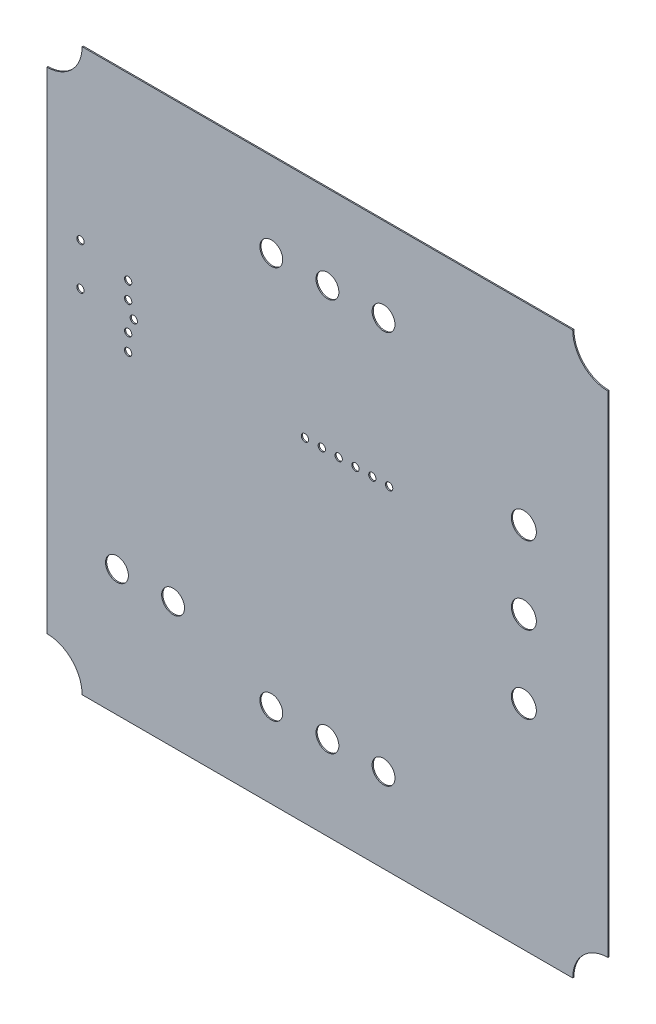
ISO-10303-21;
HEADER;
FILE_DESCRIPTION(('STEP AP214'),'2;1');
FILE_NAME('part.step','',(''),(''),'','','');
FILE_SCHEMA(('AUTOMOTIVE_DESIGN { 1 0 10303 214 1 1 1 1 }'));
ENDSEC;
DATA;
#1=APPLICATION_CONTEXT('core data for automotive mechanical design processes');
#2=APPLICATION_PROTOCOL_DEFINITION('international standard','automotive_design',2000,#1);
#3=PRODUCT_CONTEXT('',#1,'mechanical');
#4=PRODUCT('Part','Part','',(#3));
#5=PRODUCT_RELATED_PRODUCT_CATEGORY('part','',(#4));
#6=PRODUCT_DEFINITION_FORMATION('','',#4);
#7=PRODUCT_DEFINITION_CONTEXT('part definition',#1,'design');
#8=PRODUCT_DEFINITION('design','',#6,#7);
#9=PRODUCT_DEFINITION_SHAPE('','',#8);
#10=(LENGTH_UNIT() NAMED_UNIT(*) SI_UNIT(.MILLI.,.METRE.));
#11=(NAMED_UNIT(*) PLANE_ANGLE_UNIT() SI_UNIT($,.RADIAN.));
#12=(NAMED_UNIT(*) SI_UNIT($,.STERADIAN.) SOLID_ANGLE_UNIT());
#13=UNCERTAINTY_MEASURE_WITH_UNIT(LENGTH_MEASURE(1.E-05),#10,'distance_accuracy_value','');
#14=(GEOMETRIC_REPRESENTATION_CONTEXT(3) GLOBAL_UNCERTAINTY_ASSIGNED_CONTEXT((#13)) GLOBAL_UNIT_ASSIGNED_CONTEXT((#10,
#11,#12)) REPRESENTATION_CONTEXT('',''));
#15=CARTESIAN_POINT('',(0.,0.,0.));
#16=DIRECTION('',(0.,0.,1.));
#17=DIRECTION('',(1.,0.,0.));
#18=AXIS2_PLACEMENT_3D('',#15,#16,#17);
#19=CARTESIAN_POINT('',(23.81,25.3999999257102,-0.00525));
#20=DIRECTION('',(3.34488272038687E-09,1.,0.));
#21=DIRECTION('',(-1.,3.34488272038687E-09,0.));
#22=AXIS2_PLACEMENT_3D('',#19,#20,#21);
#23=PLANE('',#22);
#24=DIRECTION('',(-1.,0.,0.));
#25=VECTOR('',#24,1.);
#26=CARTESIAN_POINT('',(12.7000000371281,25.3999999257437,0.0525));
#27=LINE('',#26,#25);
#28=CARTESIAN_POINT('',(23.8,25.3999999257437,0.0525));
#29=VERTEX_POINT('',#28);
#30=CARTESIAN_POINT('',(1.6,25.3999999628719,0.0525));
#31=VERTEX_POINT('',#30);
#32=EDGE_CURVE('E202',#29,#31,#27,.T.);
#33=ORIENTED_EDGE('',*,*,#32,.F.);
#34=DIRECTION('',(0.,0.,1.));
#35=VECTOR('',#34,1.);
#36=CARTESIAN_POINT('',(23.8,25.3999999257437,0.02625));
#37=LINE('',#36,#35);
#38=CARTESIAN_POINT('',(23.8,25.3999999628719,0.));
#39=VERTEX_POINT('',#38);
#40=EDGE_CURVE('E79',#39,#29,#37,.T.);
#41=ORIENTED_EDGE('',*,*,#40,.F.);
#42=DIRECTION('',(1.,0.,0.));
#43=VECTOR('',#42,1.);
#44=CARTESIAN_POINT('',(12.7000000371281,25.4,0.));
#45=LINE('',#44,#43);
#46=CARTESIAN_POINT('',(1.6,25.4,0.));
#47=VERTEX_POINT('',#46);
#48=EDGE_CURVE('E88',#47,#39,#45,.T.);
#49=ORIENTED_EDGE('',*,*,#48,.F.);
#50=DIRECTION('',(0.,0.,-1.));
#51=VECTOR('',#50,1.);
#52=CARTESIAN_POINT('',(1.6,25.4,0.02625));
#53=LINE('',#52,#51);
#54=EDGE_CURVE('E115',#31,#47,#53,.T.);
#55=ORIENTED_EDGE('',*,*,#54,.F.);
#56=EDGE_LOOP('',(#33,#41,#49,#55));
#57=FACE_BOUND('',#56,.T.);
#58=ADVANCED_FACE('F16',(#57),#23,.T.);
#59=CARTESIAN_POINT('',(0.,25.4,0.));
#60=DIRECTION('',(0.,0.,1.));
#61=DIRECTION('',(1.,0.,0.));
#62=AXIS2_PLACEMENT_3D('',#59,#60,#61);
#63=CYLINDRICAL_SURFACE('',#62,1.6);
#64=CARTESIAN_POINT('',(0.,25.4,0.0525));
#65=DIRECTION('',(0.,0.,1.));
#66=DIRECTION('',(1.,0.,0.));
#67=AXIS2_PLACEMENT_3D('',#64,#65,#66);
#68=CIRCLE('',#67,1.6);
#69=CARTESIAN_POINT('',(3.13844967463198E-08,23.8,0.0525));
#70=VERTEX_POINT('',#69);
#71=EDGE_CURVE('E199',#31,#70,#68,.F.);
#72=ORIENTED_EDGE('',*,*,#71,.F.);
#73=ORIENTED_EDGE('',*,*,#54,.T.);
#74=CARTESIAN_POINT('',(0.,25.4,0.));
#75=DIRECTION('',(0.,0.,1.));
#76=DIRECTION('',(1.,0.,0.));
#77=AXIS2_PLACEMENT_3D('',#74,#75,#76);
#78=CIRCLE('',#77,1.6);
#79=CARTESIAN_POINT('',(4.28718338881495E-08,23.8,0.));
#80=VERTEX_POINT('',#79);
#81=EDGE_CURVE('E272',#80,#47,#78,.T.);
#82=ORIENTED_EDGE('',*,*,#81,.F.);
#83=DIRECTION('',(0.,0.,-1.));
#84=VECTOR('',#83,1.);
#85=CARTESIAN_POINT('',(3.13844963119088E-08,23.8,0.02625));
#86=LINE('',#85,#84);
#87=EDGE_CURVE('E113',#70,#80,#86,.T.);
#88=ORIENTED_EDGE('',*,*,#87,.F.);
#89=EDGE_LOOP('',(#72,#73,#82,#88));
#90=FACE_BOUND('',#89,.T.);
#91=ADVANCED_FACE('F307',(#90),#63,.F.);
#92=CARTESIAN_POINT('',(3.13741473585664E-08,23.81,-0.00525));
#93=DIRECTION('',(-1.,-1.03489533424256E-09,0.));
#94=DIRECTION('',(1.03489533424256E-09,-1.,0.));
#95=AXIS2_PLACEMENT_3D('',#92,#93,#94);
#96=PLANE('',#95);
#97=DIRECTION('',(0.,-1.,0.));
#98=VECTOR('',#97,1.);
#99=CARTESIAN_POINT('',(3.13844971807308E-08,12.6999999942563,0.0525));
#100=LINE('',#99,#98);
#101=CARTESIAN_POINT('',(4.28718349564122E-08,1.6,0.0525));
#102=VERTEX_POINT('',#101);
#103=EDGE_CURVE('E198',#70,#102,#100,.T.);
#104=ORIENTED_EDGE('',*,*,#103,.F.);
#105=ORIENTED_EDGE('',*,*,#87,.T.);
#106=DIRECTION('',(0.,1.,0.));
#107=VECTOR('',#106,1.);
#108=CARTESIAN_POINT('',(5.43591714643901E-08,12.6999999942563,0.));
#109=LINE('',#108,#107);
#110=CARTESIAN_POINT('',(5.43591720982419E-08,1.6,0.));
#111=VERTEX_POINT('',#110);
#112=EDGE_CURVE('E274',#111,#80,#109,.T.);
#113=ORIENTED_EDGE('',*,*,#112,.F.);
#114=DIRECTION('',(0.,0.,-1.));
#115=VECTOR('',#114,1.);
#116=CARTESIAN_POINT('',(5.43591727320937E-08,1.6,0.02625));
#117=LINE('',#116,#115);
#118=EDGE_CURVE('E111',#102,#111,#117,.T.);
#119=ORIENTED_EDGE('',*,*,#118,.F.);
#120=EDGE_LOOP('',(#104,#105,#113,#119));
#121=FACE_BOUND('',#120,.T.);
#122=ADVANCED_FACE('F304',(#121),#96,.T.);
#123=CARTESIAN_POINT('',(0.,0.,0.));
#124=DIRECTION('',(0.,0.,1.));
#125=DIRECTION('',(1.,0.,0.));
#126=AXIS2_PLACEMENT_3D('',#123,#124,#125);
#127=CYLINDRICAL_SURFACE('',#126,1.6);
#128=CARTESIAN_POINT('',(0.,0.,0.0525));
#129=DIRECTION('',(0.,0.,1.));
#130=DIRECTION('',(1.,0.,0.));
#131=AXIS2_PLACEMENT_3D('',#128,#129,#130);
#132=CIRCLE('',#131,1.6);
#133=CARTESIAN_POINT('',(1.6,-1.14873374239948E-08,0.0525));
#134=VERTEX_POINT('',#133);
#135=EDGE_CURVE('E195',#102,#134,#132,.F.);
#136=ORIENTED_EDGE('',*,*,#135,.F.);
#137=ORIENTED_EDGE('',*,*,#118,.T.);
#138=CARTESIAN_POINT('',(0.,0.,0.));
#139=DIRECTION('',(0.,0.,1.));
#140=DIRECTION('',(1.,0.,0.));
#141=AXIS2_PLACEMENT_3D('',#138,#139,#140);
#142=CIRCLE('',#141,1.6);
#143=CARTESIAN_POINT('',(1.6,-5.7436685498422E-09,0.));
#144=VERTEX_POINT('',#143);
#145=EDGE_CURVE('E275',#144,#111,#142,.T.);
#146=ORIENTED_EDGE('',*,*,#145,.F.);
#147=DIRECTION('',(0.,0.,-1.));
#148=VECTOR('',#147,1.);
#149=CARTESIAN_POINT('',(1.6,-1.14873371217073E-08,0.02625));
#150=LINE('',#149,#148);
#151=EDGE_CURVE('E109',#134,#144,#150,.T.);
#152=ORIENTED_EDGE('',*,*,#151,.F.);
#153=EDGE_LOOP('',(#136,#137,#146,#152));
#154=FACE_BOUND('',#153,.T.);
#155=ADVANCED_FACE('F299',(#154),#127,.F.);
#156=CARTESIAN_POINT('',(1.59,-1.14925115978882E-08,-0.00525));
#157=DIRECTION('',(5.17447618094921E-10,-1.,0.));
#158=DIRECTION('',(1.,5.17447618094921E-10,0.));
#159=AXIS2_PLACEMENT_3D('',#156,#157,#158);
#160=PLANE('',#159);
#161=DIRECTION('',(1.,0.,0.));
#162=VECTOR('',#161,1.);
#163=CARTESIAN_POINT('',(12.7000000371281,-1.14873377262824E-08,0.0525));
#164=LINE('',#163,#162);
#165=CARTESIAN_POINT('',(23.8,-5.7436688120237E-09,0.0525));
#166=VERTEX_POINT('',#165);
#167=EDGE_CURVE('E194',#134,#166,#164,.T.);
#168=ORIENTED_EDGE('',*,*,#167,.F.);
#169=ORIENTED_EDGE('',*,*,#151,.T.);
#170=DIRECTION('',(-1.,0.,0.));
#171=VECTOR('',#170,1.);
#172=CARTESIAN_POINT('',(12.7000000371281,0.,0.));
#173=LINE('',#172,#171);
#174=CARTESIAN_POINT('',(23.8,0.,0.));
#175=VERTEX_POINT('',#174);
#176=EDGE_CURVE('E277',#175,#144,#173,.T.);
#177=ORIENTED_EDGE('',*,*,#176,.F.);
#178=DIRECTION('',(0.,0.,-1.));
#179=VECTOR('',#178,1.);
#180=CARTESIAN_POINT('',(23.8,0.,0.02625));
#181=LINE('',#180,#179);
#182=EDGE_CURVE('E107',#166,#175,#181,.T.);
#183=ORIENTED_EDGE('',*,*,#182,.F.);
#184=EDGE_LOOP('',(#168,#169,#177,#183));
#185=FACE_BOUND('',#184,.T.);
#186=ADVANCED_FACE('F295',(#185),#160,.T.);
#187=CARTESIAN_POINT('',(25.4,0.,0.));
#188=DIRECTION('',(0.,0.,1.));
#189=DIRECTION('',(1.,0.,0.));
#190=AXIS2_PLACEMENT_3D('',#187,#188,#189);
#191=CYLINDRICAL_SURFACE('',#190,1.59999999999998);
#192=CARTESIAN_POINT('',(25.4,0.,0.0525));
#193=DIRECTION('',(0.,0.,1.));
#194=DIRECTION('',(1.,0.,0.));
#195=AXIS2_PLACEMENT_3D('',#192,#193,#194);
#196=CIRCLE('',#195,1.59999999999998);
#197=CARTESIAN_POINT('',(25.4000000428718,1.59999999999999,0.0525));
#198=VERTEX_POINT('',#197);
#199=EDGE_CURVE('E191',#166,#198,#196,.F.);
#200=ORIENTED_EDGE('',*,*,#199,.F.);
#201=ORIENTED_EDGE('',*,*,#182,.T.);
#202=CARTESIAN_POINT('',(25.4,0.,0.));
#203=DIRECTION('',(0.,0.,1.));
#204=DIRECTION('',(1.,0.,0.));
#205=AXIS2_PLACEMENT_3D('',#202,#203,#204);
#206=CIRCLE('',#205,1.59999999999998);
#207=CARTESIAN_POINT('',(25.4000000214359,1.59999999999999,0.));
#208=VERTEX_POINT('',#207);
#209=EDGE_CURVE('E97',#208,#175,#206,.T.);
#210=ORIENTED_EDGE('',*,*,#209,.F.);
#211=DIRECTION('',(0.,0.,-1.));
#212=VECTOR('',#211,1.);
#213=CARTESIAN_POINT('',(25.4000000428719,1.6,0.02625));
#214=LINE('',#213,#212);
#215=EDGE_CURVE('E93',#198,#208,#214,.T.);
#216=ORIENTED_EDGE('',*,*,#215,.F.);
#217=EDGE_LOOP('',(#200,#201,#210,#216));
#218=FACE_BOUND('',#217,.T.);
#219=ADVANCED_FACE('F293',(#218),#191,.F.);
#220=CARTESIAN_POINT('',(25.4000000428912,1.59,-0.00525));
#221=DIRECTION('',(1.,1.93116537362885E-09,0.));
#222=DIRECTION('',(-1.93116537362885E-09,1.,0.));
#223=AXIS2_PLACEMENT_3D('',#220,#221,#222);
#224=PLANE('',#223);
#225=DIRECTION('',(0.,1.,0.));
#226=VECTOR('',#225,1.);
#227=CARTESIAN_POINT('',(25.4000000428718,12.6999999942563,0.0525));
#228=LINE('',#227,#226);
#229=CARTESIAN_POINT('',(25.4000000214359,23.8,0.0525));
#230=VERTEX_POINT('',#229);
#231=EDGE_CURVE('E190',#198,#230,#228,.T.);
#232=ORIENTED_EDGE('',*,*,#231,.F.);
#233=ORIENTED_EDGE('',*,*,#215,.T.);
#234=DIRECTION('',(0.,-1.,0.));
#235=VECTOR('',#234,1.);
#236=CARTESIAN_POINT('',(25.4,12.6999999942563,0.));
#237=LINE('',#236,#235);
#238=CARTESIAN_POINT('',(25.4,23.8,0.));
#239=VERTEX_POINT('',#238);
#240=EDGE_CURVE('E91',#239,#208,#237,.T.);
#241=ORIENTED_EDGE('',*,*,#240,.F.);
#242=DIRECTION('',(0.,0.,-1.));
#243=VECTOR('',#242,1.);
#244=CARTESIAN_POINT('',(25.4,23.8,0.02625));
#245=LINE('',#244,#243);
#246=EDGE_CURVE('E35',#230,#239,#245,.T.);
#247=ORIENTED_EDGE('',*,*,#246,.F.);
#248=EDGE_LOOP('',(#232,#233,#241,#247));
#249=FACE_BOUND('',#248,.T.);
#250=ADVANCED_FACE('F92',(#249),#224,.T.);
#251=CARTESIAN_POINT('',(25.4,25.4,0.));
#252=DIRECTION('',(0.,0.,1.));
#253=DIRECTION('',(1.,0.,0.));
#254=AXIS2_PLACEMENT_3D('',#251,#252,#253);
#255=CYLINDRICAL_SURFACE('',#254,1.6);
#256=CARTESIAN_POINT('',(25.4,25.4,0.0525));
#257=DIRECTION('',(0.,0.,1.));
#258=DIRECTION('',(1.,0.,0.));
#259=AXIS2_PLACEMENT_3D('',#256,#257,#258);
#260=CIRCLE('',#259,1.6);
#261=EDGE_CURVE('E86',#230,#29,#260,.F.);
#262=ORIENTED_EDGE('',*,*,#261,.F.);
#263=ORIENTED_EDGE('',*,*,#246,.T.);
#264=CARTESIAN_POINT('',(25.4,25.4,0.));
#265=DIRECTION('',(0.,0.,1.));
#266=DIRECTION('',(1.,0.,0.));
#267=AXIS2_PLACEMENT_3D('',#264,#265,#266);
#268=CIRCLE('',#267,1.6);
#269=EDGE_CURVE('E20',#39,#239,#268,.T.);
#270=ORIENTED_EDGE('',*,*,#269,.F.);
#271=ORIENTED_EDGE('',*,*,#40,.T.);
#272=EDGE_LOOP('',(#262,#263,#270,#271));
#273=FACE_BOUND('',#272,.T.);
#274=ADVANCED_FACE('F82',(#273),#255,.F.);
#275=CARTESIAN_POINT('',(11.684,15.113,0.));
#276=DIRECTION('',(0.,0.,1.));
#277=DIRECTION('',(1.,0.,0.));
#278=AXIS2_PLACEMENT_3D('',#275,#276,#277);
#279=CYLINDRICAL_SURFACE('',#278,0.164999999999999);
#280=CARTESIAN_POINT('',(11.684,15.113,0.0525));
#281=DIRECTION('',(0.,0.,1.));
#282=DIRECTION('',(1.,0.,0.));
#283=AXIS2_PLACEMENT_3D('',#280,#281,#282);
#284=CIRCLE('',#283,0.164999999999999);
#285=CARTESIAN_POINT('',(11.849,15.113,0.0525));
#286=VERTEX_POINT('',#285);
#287=EDGE_CURVE('E186',#286,#286,#284,.F.);
#288=ORIENTED_EDGE('',*,*,#287,.F.);
#289=EDGE_LOOP('',(#288));
#290=FACE_BOUND('',#289,.T.);
#291=CARTESIAN_POINT('',(11.684,15.113,0.));
#292=DIRECTION('',(0.,0.,1.));
#293=DIRECTION('',(1.,0.,0.));
#294=AXIS2_PLACEMENT_3D('',#291,#292,#293);
#295=CIRCLE('',#294,0.164999999999999);
#296=CARTESIAN_POINT('',(11.849,15.113,0.));
#297=VERTEX_POINT('',#296);
#298=EDGE_CURVE('E269',#297,#297,#295,.T.);
#299=ORIENTED_EDGE('',*,*,#298,.F.);
#300=EDGE_LOOP('',(#299));
#301=FACE_BOUND('',#300,.T.);
#302=ADVANCED_FACE('F419',(#290,#301),#279,.F.);
#303=CARTESIAN_POINT('',(14.732,15.113,0.));
#304=DIRECTION('',(0.,0.,1.));
#305=DIRECTION('',(1.,0.,0.));
#306=AXIS2_PLACEMENT_3D('',#303,#304,#305);
#307=CYLINDRICAL_SURFACE('',#306,0.165000000000001);
#308=CARTESIAN_POINT('',(14.732,15.113,0.0525));
#309=DIRECTION('',(0.,0.,1.));
#310=DIRECTION('',(1.,0.,0.));
#311=AXIS2_PLACEMENT_3D('',#308,#309,#310);
#312=CIRCLE('',#311,0.165000000000001);
#313=CARTESIAN_POINT('',(14.897,15.113,0.0525));
#314=VERTEX_POINT('',#313);
#315=EDGE_CURVE('E183',#314,#314,#312,.F.);
#316=ORIENTED_EDGE('',*,*,#315,.F.);
#317=EDGE_LOOP('',(#316));
#318=FACE_BOUND('',#317,.T.);
#319=CARTESIAN_POINT('',(14.732,15.113,0.));
#320=DIRECTION('',(0.,0.,1.));
#321=DIRECTION('',(1.,0.,0.));
#322=AXIS2_PLACEMENT_3D('',#319,#320,#321);
#323=CIRCLE('',#322,0.165000000000001);
#324=CARTESIAN_POINT('',(14.897,15.113,0.));
#325=VERTEX_POINT('',#324);
#326=EDGE_CURVE('E266',#325,#325,#323,.T.);
#327=ORIENTED_EDGE('',*,*,#326,.F.);
#328=EDGE_LOOP('',(#327));
#329=FACE_BOUND('',#328,.T.);
#330=ADVANCED_FACE('F415',(#318,#329),#307,.F.);
#331=CARTESIAN_POINT('',(13.208,15.113,0.));
#332=DIRECTION('',(0.,0.,1.));
#333=DIRECTION('',(1.,0.,0.));
#334=AXIS2_PLACEMENT_3D('',#331,#332,#333);
#335=CYLINDRICAL_SURFACE('',#334,0.165000000000001);
#336=CARTESIAN_POINT('',(13.208,15.113,0.0525));
#337=DIRECTION('',(0.,0.,1.));
#338=DIRECTION('',(1.,0.,0.));
#339=AXIS2_PLACEMENT_3D('',#336,#337,#338);
#340=CIRCLE('',#339,0.165000000000001);
#341=CARTESIAN_POINT('',(13.373,15.113,0.0525));
#342=VERTEX_POINT('',#341);
#343=EDGE_CURVE('E180',#342,#342,#340,.F.);
#344=ORIENTED_EDGE('',*,*,#343,.F.);
#345=EDGE_LOOP('',(#344));
#346=FACE_BOUND('',#345,.T.);
#347=CARTESIAN_POINT('',(13.208,15.113,0.));
#348=DIRECTION('',(0.,0.,1.));
#349=DIRECTION('',(1.,0.,0.));
#350=AXIS2_PLACEMENT_3D('',#347,#348,#349);
#351=CIRCLE('',#350,0.165000000000001);
#352=CARTESIAN_POINT('',(13.373,15.113,0.));
#353=VERTEX_POINT('',#352);
#354=EDGE_CURVE('E263',#353,#353,#351,.T.);
#355=ORIENTED_EDGE('',*,*,#354,.F.);
#356=EDGE_LOOP('',(#355));
#357=FACE_BOUND('',#356,.T.);
#358=ADVANCED_FACE('F411',(#346,#357),#335,.F.);
#359=CARTESIAN_POINT('',(3.683,14.478,0.));
#360=DIRECTION('',(0.,0.,1.));
#361=DIRECTION('',(1.,0.,0.));
#362=AXIS2_PLACEMENT_3D('',#359,#360,#361);
#363=CYLINDRICAL_SURFACE('',#362,0.165);
#364=CARTESIAN_POINT('',(3.683,14.478,0.0525));
#365=DIRECTION('',(0.,0.,1.));
#366=DIRECTION('',(1.,0.,0.));
#367=AXIS2_PLACEMENT_3D('',#364,#365,#366);
#368=CIRCLE('',#367,0.165);
#369=CARTESIAN_POINT('',(3.848,14.478,0.0525));
#370=VERTEX_POINT('',#369);
#371=EDGE_CURVE('E177',#370,#370,#368,.F.);
#372=ORIENTED_EDGE('',*,*,#371,.F.);
#373=EDGE_LOOP('',(#372));
#374=FACE_BOUND('',#373,.T.);
#375=CARTESIAN_POINT('',(3.683,14.478,0.));
#376=DIRECTION('',(0.,0.,1.));
#377=DIRECTION('',(1.,0.,0.));
#378=AXIS2_PLACEMENT_3D('',#375,#376,#377);
#379=CIRCLE('',#378,0.165);
#380=CARTESIAN_POINT('',(3.848,14.478,0.));
#381=VERTEX_POINT('',#380);
#382=EDGE_CURVE('E260',#381,#381,#379,.T.);
#383=ORIENTED_EDGE('',*,*,#382,.F.);
#384=EDGE_LOOP('',(#383));
#385=FACE_BOUND('',#384,.T.);
#386=ADVANCED_FACE('F407',(#374,#385),#363,.F.);
#387=CARTESIAN_POINT('',(3.683,16.51,0.));
#388=DIRECTION('',(0.,0.,1.));
#389=DIRECTION('',(1.,0.,0.));
#390=AXIS2_PLACEMENT_3D('',#387,#388,#389);
#391=CYLINDRICAL_SURFACE('',#390,0.165000000000002);
#392=CARTESIAN_POINT('',(3.683,16.51,0.0525));
#393=DIRECTION('',(0.,0.,1.));
#394=DIRECTION('',(1.,0.,0.));
#395=AXIS2_PLACEMENT_3D('',#392,#393,#394);
#396=CIRCLE('',#395,0.165000000000002);
#397=CARTESIAN_POINT('',(3.848,16.51,0.0525));
#398=VERTEX_POINT('',#397);
#399=EDGE_CURVE('E174',#398,#398,#396,.F.);
#400=ORIENTED_EDGE('',*,*,#399,.F.);
#401=EDGE_LOOP('',(#400));
#402=FACE_BOUND('',#401,.T.);
#403=CARTESIAN_POINT('',(3.683,16.51,0.));
#404=DIRECTION('',(0.,0.,1.));
#405=DIRECTION('',(1.,0.,0.));
#406=AXIS2_PLACEMENT_3D('',#403,#404,#405);
#407=CIRCLE('',#406,0.165000000000002);
#408=CARTESIAN_POINT('',(3.848,16.51,0.));
#409=VERTEX_POINT('',#408);
#410=EDGE_CURVE('E257',#409,#409,#407,.T.);
#411=ORIENTED_EDGE('',*,*,#410,.F.);
#412=EDGE_LOOP('',(#411));
#413=FACE_BOUND('',#412,.T.);
#414=ADVANCED_FACE('F403',(#402,#413),#391,.F.);
#415=CARTESIAN_POINT('',(10.16,21.59,0.));
#416=DIRECTION('',(0.,0.,1.));
#417=DIRECTION('',(1.,0.,0.));
#418=AXIS2_PLACEMENT_3D('',#415,#416,#417);
#419=CYLINDRICAL_SURFACE('',#418,0.51755);
#420=CARTESIAN_POINT('',(10.16,21.59,0.0525));
#421=DIRECTION('',(0.,0.,1.));
#422=DIRECTION('',(1.,0.,0.));
#423=AXIS2_PLACEMENT_3D('',#420,#421,#422);
#424=CIRCLE('',#423,0.51755);
#425=CARTESIAN_POINT('',(10.67755,21.59,0.0525));
#426=VERTEX_POINT('',#425);
#427=EDGE_CURVE('E171',#426,#426,#424,.F.);
#428=ORIENTED_EDGE('',*,*,#427,.F.);
#429=EDGE_LOOP('',(#428));
#430=FACE_BOUND('',#429,.T.);
#431=CARTESIAN_POINT('',(10.16,21.59,0.));
#432=DIRECTION('',(0.,0.,1.));
#433=DIRECTION('',(1.,0.,0.));
#434=AXIS2_PLACEMENT_3D('',#431,#432,#433);
#435=CIRCLE('',#434,0.51755);
#436=CARTESIAN_POINT('',(10.67755,21.59,0.));
#437=VERTEX_POINT('',#436);
#438=EDGE_CURVE('E254',#437,#437,#435,.T.);
#439=ORIENTED_EDGE('',*,*,#438,.F.);
#440=EDGE_LOOP('',(#439));
#441=FACE_BOUND('',#440,.T.);
#442=ADVANCED_FACE('F399',(#430,#441),#419,.F.);
#443=CARTESIAN_POINT('',(15.24,21.59,0.));
#444=DIRECTION('',(0.,0.,1.));
#445=DIRECTION('',(1.,0.,0.));
#446=AXIS2_PLACEMENT_3D('',#443,#444,#445);
#447=CYLINDRICAL_SURFACE('',#446,0.517549999999999);
#448=CARTESIAN_POINT('',(15.24,21.59,0.0525));
#449=DIRECTION('',(0.,0.,1.));
#450=DIRECTION('',(1.,0.,0.));
#451=AXIS2_PLACEMENT_3D('',#448,#449,#450);
#452=CIRCLE('',#451,0.517549999999999);
#453=CARTESIAN_POINT('',(15.75755,21.59,0.0525));
#454=VERTEX_POINT('',#453);
#455=EDGE_CURVE('E168',#454,#454,#452,.F.);
#456=ORIENTED_EDGE('',*,*,#455,.F.);
#457=EDGE_LOOP('',(#456));
#458=FACE_BOUND('',#457,.T.);
#459=CARTESIAN_POINT('',(15.24,21.59,0.));
#460=DIRECTION('',(0.,0.,1.));
#461=DIRECTION('',(1.,0.,0.));
#462=AXIS2_PLACEMENT_3D('',#459,#460,#461);
#463=CIRCLE('',#462,0.517549999999999);
#464=CARTESIAN_POINT('',(15.75755,21.59,0.));
#465=VERTEX_POINT('',#464);
#466=EDGE_CURVE('E251',#465,#465,#463,.T.);
#467=ORIENTED_EDGE('',*,*,#466,.F.);
#468=EDGE_LOOP('',(#467));
#469=FACE_BOUND('',#468,.T.);
#470=ADVANCED_FACE('F395',(#458,#469),#447,.F.);
#471=CARTESIAN_POINT('',(12.7,3.81,0.));
#472=DIRECTION('',(0.,0.,1.));
#473=DIRECTION('',(1.,0.,0.));
#474=AXIS2_PLACEMENT_3D('',#471,#472,#473);
#475=CYLINDRICAL_SURFACE('',#474,0.517549999999999);
#476=CARTESIAN_POINT('',(12.7,3.81,0.0525));
#477=DIRECTION('',(0.,0.,1.));
#478=DIRECTION('',(1.,0.,0.));
#479=AXIS2_PLACEMENT_3D('',#476,#477,#478);
#480=CIRCLE('',#479,0.517549999999999);
#481=CARTESIAN_POINT('',(13.21755,3.81,0.0525));
#482=VERTEX_POINT('',#481);
#483=EDGE_CURVE('E165',#482,#482,#480,.F.);
#484=ORIENTED_EDGE('',*,*,#483,.F.);
#485=EDGE_LOOP('',(#484));
#486=FACE_BOUND('',#485,.T.);
#487=CARTESIAN_POINT('',(12.7,3.81,0.));
#488=DIRECTION('',(0.,0.,1.));
#489=DIRECTION('',(1.,0.,0.));
#490=AXIS2_PLACEMENT_3D('',#487,#488,#489);
#491=CIRCLE('',#490,0.517549999999999);
#492=CARTESIAN_POINT('',(13.21755,3.81,0.));
#493=VERTEX_POINT('',#492);
#494=EDGE_CURVE('E248',#493,#493,#491,.T.);
#495=ORIENTED_EDGE('',*,*,#494,.F.);
#496=EDGE_LOOP('',(#495));
#497=FACE_BOUND('',#496,.T.);
#498=ADVANCED_FACE('F391',(#486,#497),#475,.F.);
#499=CARTESIAN_POINT('',(3.175,5.715,0.));
#500=DIRECTION('',(0.,0.,1.));
#501=DIRECTION('',(1.,0.,0.));
#502=AXIS2_PLACEMENT_3D('',#499,#500,#501);
#503=CYLINDRICAL_SURFACE('',#502,0.51755);
#504=CARTESIAN_POINT('',(3.175,5.715,0.0525));
#505=DIRECTION('',(0.,0.,1.));
#506=DIRECTION('',(1.,0.,0.));
#507=AXIS2_PLACEMENT_3D('',#504,#505,#506);
#508=CIRCLE('',#507,0.51755);
#509=CARTESIAN_POINT('',(3.69255,5.715,0.0525));
#510=VERTEX_POINT('',#509);
#511=EDGE_CURVE('E162',#510,#510,#508,.F.);
#512=ORIENTED_EDGE('',*,*,#511,.F.);
#513=EDGE_LOOP('',(#512));
#514=FACE_BOUND('',#513,.T.);
#515=CARTESIAN_POINT('',(3.175,5.715,0.));
#516=DIRECTION('',(0.,0.,1.));
#517=DIRECTION('',(1.,0.,0.));
#518=AXIS2_PLACEMENT_3D('',#515,#516,#517);
#519=CIRCLE('',#518,0.51755);
#520=CARTESIAN_POINT('',(3.69255,5.715,0.));
#521=VERTEX_POINT('',#520);
#522=EDGE_CURVE('E245',#521,#521,#519,.T.);
#523=ORIENTED_EDGE('',*,*,#522,.F.);
#524=EDGE_LOOP('',(#523));
#525=FACE_BOUND('',#524,.T.);
#526=ADVANCED_FACE('F387',(#514,#525),#503,.F.);
#527=CARTESIAN_POINT('',(21.59,16.652,0.));
#528=DIRECTION('',(0.,0.,1.));
#529=DIRECTION('',(1.,0.,0.));
#530=AXIS2_PLACEMENT_3D('',#527,#528,#529);
#531=CYLINDRICAL_SURFACE('',#530,0.565000000000001);
#532=CARTESIAN_POINT('',(21.59,16.652,0.0525));
#533=DIRECTION('',(0.,0.,1.));
#534=DIRECTION('',(1.,0.,0.));
#535=AXIS2_PLACEMENT_3D('',#532,#533,#534);
#536=CIRCLE('',#535,0.565000000000001);
#537=CARTESIAN_POINT('',(22.155,16.652,0.0525));
#538=VERTEX_POINT('',#537);
#539=EDGE_CURVE('E159',#538,#538,#536,.F.);
#540=ORIENTED_EDGE('',*,*,#539,.F.);
#541=EDGE_LOOP('',(#540));
#542=FACE_BOUND('',#541,.T.);
#543=CARTESIAN_POINT('',(21.59,16.652,0.));
#544=DIRECTION('',(0.,0.,1.));
#545=DIRECTION('',(1.,0.,0.));
#546=AXIS2_PLACEMENT_3D('',#543,#544,#545);
#547=CIRCLE('',#546,0.565000000000001);
#548=CARTESIAN_POINT('',(22.155,16.652,0.));
#549=VERTEX_POINT('',#548);
#550=EDGE_CURVE('E242',#549,#549,#547,.T.);
#551=ORIENTED_EDGE('',*,*,#550,.F.);
#552=EDGE_LOOP('',(#551));
#553=FACE_BOUND('',#552,.T.);
#554=ADVANCED_FACE('F383',(#542,#553),#531,.F.);
#555=CARTESIAN_POINT('',(21.59,9.652,0.));
#556=DIRECTION('',(0.,0.,1.));
#557=DIRECTION('',(1.,0.,0.));
#558=AXIS2_PLACEMENT_3D('',#555,#556,#557);
#559=CYLINDRICAL_SURFACE('',#558,0.565000000000002);
#560=CARTESIAN_POINT('',(21.59,9.652,0.0525));
#561=DIRECTION('',(0.,0.,1.));
#562=DIRECTION('',(1.,0.,0.));
#563=AXIS2_PLACEMENT_3D('',#560,#561,#562);
#564=CIRCLE('',#563,0.565000000000002);
#565=CARTESIAN_POINT('',(22.155,9.652,0.0525));
#566=VERTEX_POINT('',#565);
#567=EDGE_CURVE('E156',#566,#566,#564,.F.);
#568=ORIENTED_EDGE('',*,*,#567,.F.);
#569=EDGE_LOOP('',(#568));
#570=FACE_BOUND('',#569,.T.);
#571=CARTESIAN_POINT('',(21.59,9.652,0.));
#572=DIRECTION('',(0.,0.,1.));
#573=DIRECTION('',(1.,0.,0.));
#574=AXIS2_PLACEMENT_3D('',#571,#572,#573);
#575=CIRCLE('',#574,0.565000000000002);
#576=CARTESIAN_POINT('',(22.155,9.652,0.));
#577=VERTEX_POINT('',#576);
#578=EDGE_CURVE('E239',#577,#577,#575,.T.);
#579=ORIENTED_EDGE('',*,*,#578,.F.);
#580=EDGE_LOOP('',(#579));
#581=FACE_BOUND('',#580,.T.);
#582=ADVANCED_FACE('F379',(#570,#581),#559,.F.);
#583=CARTESIAN_POINT('',(21.59,13.152,0.));
#584=DIRECTION('',(0.,0.,1.));
#585=DIRECTION('',(1.,0.,0.));
#586=AXIS2_PLACEMENT_3D('',#583,#584,#585);
#587=CYLINDRICAL_SURFACE('',#586,0.565000000000002);
#588=CARTESIAN_POINT('',(21.59,13.152,0.0525));
#589=DIRECTION('',(0.,0.,1.));
#590=DIRECTION('',(1.,0.,0.));
#591=AXIS2_PLACEMENT_3D('',#588,#589,#590);
#592=CIRCLE('',#591,0.565000000000002);
#593=CARTESIAN_POINT('',(22.155,13.152,0.0525));
#594=VERTEX_POINT('',#593);
#595=EDGE_CURVE('E153',#594,#594,#592,.F.);
#596=ORIENTED_EDGE('',*,*,#595,.F.);
#597=EDGE_LOOP('',(#596));
#598=FACE_BOUND('',#597,.T.);
#599=CARTESIAN_POINT('',(21.59,13.152,0.));
#600=DIRECTION('',(0.,0.,1.));
#601=DIRECTION('',(1.,0.,0.));
#602=AXIS2_PLACEMENT_3D('',#599,#600,#601);
#603=CIRCLE('',#602,0.565000000000002);
#604=CARTESIAN_POINT('',(22.155,13.152,0.));
#605=VERTEX_POINT('',#604);
#606=EDGE_CURVE('E236',#605,#605,#603,.T.);
#607=ORIENTED_EDGE('',*,*,#606,.F.);
#608=EDGE_LOOP('',(#607));
#609=FACE_BOUND('',#608,.T.);
#610=ADVANCED_FACE('F375',(#598,#609),#587,.F.);
#611=CARTESIAN_POINT('',(5.715,5.715,0.));
#612=DIRECTION('',(0.,0.,1.));
#613=DIRECTION('',(1.,0.,0.));
#614=AXIS2_PLACEMENT_3D('',#611,#612,#613);
#615=CYLINDRICAL_SURFACE('',#614,0.51755);
#616=CARTESIAN_POINT('',(5.715,5.715,0.0525));
#617=DIRECTION('',(0.,0.,1.));
#618=DIRECTION('',(1.,0.,0.));
#619=AXIS2_PLACEMENT_3D('',#616,#617,#618);
#620=CIRCLE('',#619,0.51755);
#621=CARTESIAN_POINT('',(6.23255,5.715,0.0525));
#622=VERTEX_POINT('',#621);
#623=EDGE_CURVE('E150',#622,#622,#620,.F.);
#624=ORIENTED_EDGE('',*,*,#623,.F.);
#625=EDGE_LOOP('',(#624));
#626=FACE_BOUND('',#625,.T.);
#627=CARTESIAN_POINT('',(5.715,5.715,0.));
#628=DIRECTION('',(0.,0.,1.));
#629=DIRECTION('',(1.,0.,0.));
#630=AXIS2_PLACEMENT_3D('',#627,#628,#629);
#631=CIRCLE('',#630,0.51755);
#632=CARTESIAN_POINT('',(6.23255,5.715,0.));
#633=VERTEX_POINT('',#632);
#634=EDGE_CURVE('E233',#633,#633,#631,.T.);
#635=ORIENTED_EDGE('',*,*,#634,.F.);
#636=EDGE_LOOP('',(#635));
#637=FACE_BOUND('',#636,.T.);
#638=ADVANCED_FACE('F371',(#626,#637),#615,.F.);
#639=CARTESIAN_POINT('',(15.24,3.81,0.));
#640=DIRECTION('',(0.,0.,1.));
#641=DIRECTION('',(1.,0.,0.));
#642=AXIS2_PLACEMENT_3D('',#639,#640,#641);
#643=CYLINDRICAL_SURFACE('',#642,0.517549999999999);
#644=CARTESIAN_POINT('',(15.24,3.81,0.0525));
#645=DIRECTION('',(0.,0.,1.));
#646=DIRECTION('',(1.,0.,0.));
#647=AXIS2_PLACEMENT_3D('',#644,#645,#646);
#648=CIRCLE('',#647,0.517549999999999);
#649=CARTESIAN_POINT('',(15.75755,3.81,0.0525));
#650=VERTEX_POINT('',#649);
#651=EDGE_CURVE('E147',#650,#650,#648,.F.);
#652=ORIENTED_EDGE('',*,*,#651,.F.);
#653=EDGE_LOOP('',(#652));
#654=FACE_BOUND('',#653,.T.);
#655=CARTESIAN_POINT('',(15.24,3.81,0.));
#656=DIRECTION('',(0.,0.,1.));
#657=DIRECTION('',(1.,0.,0.));
#658=AXIS2_PLACEMENT_3D('',#655,#656,#657);
#659=CIRCLE('',#658,0.517549999999999);
#660=CARTESIAN_POINT('',(15.75755,3.81,0.));
#661=VERTEX_POINT('',#660);
#662=EDGE_CURVE('E230',#661,#661,#659,.T.);
#663=ORIENTED_EDGE('',*,*,#662,.F.);
#664=EDGE_LOOP('',(#663));
#665=FACE_BOUND('',#664,.T.);
#666=ADVANCED_FACE('F367',(#654,#665),#643,.F.);
#667=CARTESIAN_POINT('',(10.16,3.81,0.));
#668=DIRECTION('',(0.,0.,1.));
#669=DIRECTION('',(1.,0.,0.));
#670=AXIS2_PLACEMENT_3D('',#667,#668,#669);
#671=CYLINDRICAL_SURFACE('',#670,0.51755);
#672=CARTESIAN_POINT('',(10.16,3.81,0.0525));
#673=DIRECTION('',(0.,0.,1.));
#674=DIRECTION('',(1.,0.,0.));
#675=AXIS2_PLACEMENT_3D('',#672,#673,#674);
#676=CIRCLE('',#675,0.51755);
#677=CARTESIAN_POINT('',(10.67755,3.81,0.0525));
#678=VERTEX_POINT('',#677);
#679=EDGE_CURVE('E144',#678,#678,#676,.F.);
#680=ORIENTED_EDGE('',*,*,#679,.F.);
#681=EDGE_LOOP('',(#680));
#682=FACE_BOUND('',#681,.T.);
#683=CARTESIAN_POINT('',(10.16,3.81,0.));
#684=DIRECTION('',(0.,0.,1.));
#685=DIRECTION('',(1.,0.,0.));
#686=AXIS2_PLACEMENT_3D('',#683,#684,#685);
#687=CIRCLE('',#686,0.51755);
#688=CARTESIAN_POINT('',(10.67755,3.81,0.));
#689=VERTEX_POINT('',#688);
#690=EDGE_CURVE('E227',#689,#689,#687,.T.);
#691=ORIENTED_EDGE('',*,*,#690,.F.);
#692=EDGE_LOOP('',(#691));
#693=FACE_BOUND('',#692,.T.);
#694=ADVANCED_FACE('F363',(#682,#693),#671,.F.);
#695=CARTESIAN_POINT('',(12.7,21.59,0.));
#696=DIRECTION('',(0.,0.,1.));
#697=DIRECTION('',(1.,0.,0.));
#698=AXIS2_PLACEMENT_3D('',#695,#696,#697);
#699=CYLINDRICAL_SURFACE('',#698,0.51755);
#700=CARTESIAN_POINT('',(12.7,21.59,0.0525));
#701=DIRECTION('',(0.,0.,1.));
#702=DIRECTION('',(1.,0.,0.));
#703=AXIS2_PLACEMENT_3D('',#700,#701,#702);
#704=CIRCLE('',#703,0.51755);
#705=CARTESIAN_POINT('',(13.21755,21.59,0.0525));
#706=VERTEX_POINT('',#705);
#707=EDGE_CURVE('E141',#706,#706,#704,.F.);
#708=ORIENTED_EDGE('',*,*,#707,.F.);
#709=EDGE_LOOP('',(#708));
#710=FACE_BOUND('',#709,.T.);
#711=CARTESIAN_POINT('',(12.7,21.59,0.));
#712=DIRECTION('',(0.,0.,1.));
#713=DIRECTION('',(1.,0.,0.));
#714=AXIS2_PLACEMENT_3D('',#711,#712,#713);
#715=CIRCLE('',#714,0.51755);
#716=CARTESIAN_POINT('',(13.21755,21.59,0.));
#717=VERTEX_POINT('',#716);
#718=EDGE_CURVE('E224',#717,#717,#715,.T.);
#719=ORIENTED_EDGE('',*,*,#718,.F.);
#720=EDGE_LOOP('',(#719));
#721=FACE_BOUND('',#720,.T.);
#722=ADVANCED_FACE('F359',(#710,#721),#699,.F.);
#723=CARTESIAN_POINT('',(3.937,15.875,0.));
#724=DIRECTION('',(0.,0.,1.));
#725=DIRECTION('',(1.,0.,0.));
#726=AXIS2_PLACEMENT_3D('',#723,#724,#725);
#727=CYLINDRICAL_SURFACE('',#726,0.165000000000002);
#728=CARTESIAN_POINT('',(3.937,15.875,0.0525));
#729=DIRECTION('',(0.,0.,1.));
#730=DIRECTION('',(1.,0.,0.));
#731=AXIS2_PLACEMENT_3D('',#728,#729,#730);
#732=CIRCLE('',#731,0.165000000000002);
#733=CARTESIAN_POINT('',(4.102,15.875,0.0525));
#734=VERTEX_POINT('',#733);
#735=EDGE_CURVE('E138',#734,#734,#732,.F.);
#736=ORIENTED_EDGE('',*,*,#735,.F.);
#737=EDGE_LOOP('',(#736));
#738=FACE_BOUND('',#737,.T.);
#739=CARTESIAN_POINT('',(3.937,15.875,0.));
#740=DIRECTION('',(0.,0.,1.));
#741=DIRECTION('',(1.,0.,0.));
#742=AXIS2_PLACEMENT_3D('',#739,#740,#741);
#743=CIRCLE('',#742,0.165000000000002);
#744=CARTESIAN_POINT('',(4.102,15.875,0.));
#745=VERTEX_POINT('',#744);
#746=EDGE_CURVE('E221',#745,#745,#743,.T.);
#747=ORIENTED_EDGE('',*,*,#746,.F.);
#748=EDGE_LOOP('',(#747));
#749=FACE_BOUND('',#748,.T.);
#750=ADVANCED_FACE('F355',(#738,#749),#727,.F.);
#751=CARTESIAN_POINT('',(3.683,15.24,0.));
#752=DIRECTION('',(0.,0.,1.));
#753=DIRECTION('',(1.,0.,0.));
#754=AXIS2_PLACEMENT_3D('',#751,#752,#753);
#755=CYLINDRICAL_SURFACE('',#754,0.164999999999997);
#756=CARTESIAN_POINT('',(3.683,15.24,0.0525));
#757=DIRECTION('',(0.,0.,1.));
#758=DIRECTION('',(1.,0.,0.));
#759=AXIS2_PLACEMENT_3D('',#756,#757,#758);
#760=CIRCLE('',#759,0.164999999999997);
#761=CARTESIAN_POINT('',(3.848,15.24,0.0525));
#762=VERTEX_POINT('',#761);
#763=EDGE_CURVE('E135',#762,#762,#760,.F.);
#764=ORIENTED_EDGE('',*,*,#763,.F.);
#765=EDGE_LOOP('',(#764));
#766=FACE_BOUND('',#765,.T.);
#767=CARTESIAN_POINT('',(3.683,15.24,0.));
#768=DIRECTION('',(0.,0.,1.));
#769=DIRECTION('',(1.,0.,0.));
#770=AXIS2_PLACEMENT_3D('',#767,#768,#769);
#771=CIRCLE('',#770,0.164999999999997);
#772=CARTESIAN_POINT('',(3.848,15.24,0.));
#773=VERTEX_POINT('',#772);
#774=EDGE_CURVE('E218',#773,#773,#771,.T.);
#775=ORIENTED_EDGE('',*,*,#774,.F.);
#776=EDGE_LOOP('',(#775));
#777=FACE_BOUND('',#776,.T.);
#778=ADVANCED_FACE('F351',(#766,#777),#755,.F.);
#779=CARTESIAN_POINT('',(3.683,17.272,0.));
#780=DIRECTION('',(0.,0.,1.));
#781=DIRECTION('',(1.,0.,0.));
#782=AXIS2_PLACEMENT_3D('',#779,#780,#781);
#783=CYLINDRICAL_SURFACE('',#782,0.164999999999998);
#784=CARTESIAN_POINT('',(3.683,17.272,0.0525));
#785=DIRECTION('',(0.,0.,1.));
#786=DIRECTION('',(1.,0.,0.));
#787=AXIS2_PLACEMENT_3D('',#784,#785,#786);
#788=CIRCLE('',#787,0.164999999999998);
#789=CARTESIAN_POINT('',(3.848,17.272,0.0525));
#790=VERTEX_POINT('',#789);
#791=EDGE_CURVE('E132',#790,#790,#788,.F.);
#792=ORIENTED_EDGE('',*,*,#791,.F.);
#793=EDGE_LOOP('',(#792));
#794=FACE_BOUND('',#793,.T.);
#795=CARTESIAN_POINT('',(3.683,17.272,0.));
#796=DIRECTION('',(0.,0.,1.));
#797=DIRECTION('',(1.,0.,0.));
#798=AXIS2_PLACEMENT_3D('',#795,#796,#797);
#799=CIRCLE('',#798,0.164999999999998);
#800=CARTESIAN_POINT('',(3.848,17.272,0.));
#801=VERTEX_POINT('',#800);
#802=EDGE_CURVE('E215',#801,#801,#799,.T.);
#803=ORIENTED_EDGE('',*,*,#802,.F.);
#804=EDGE_LOOP('',(#803));
#805=FACE_BOUND('',#804,.T.);
#806=ADVANCED_FACE('F347',(#794,#805),#783,.F.);
#807=CARTESIAN_POINT('',(13.97,15.113,0.));
#808=DIRECTION('',(0.,0.,1.));
#809=DIRECTION('',(1.,0.,0.));
#810=AXIS2_PLACEMENT_3D('',#807,#808,#809);
#811=CYLINDRICAL_SURFACE('',#810,0.165000000000001);
#812=CARTESIAN_POINT('',(13.97,15.113,0.0525));
#813=DIRECTION('',(0.,0.,1.));
#814=DIRECTION('',(1.,0.,0.));
#815=AXIS2_PLACEMENT_3D('',#812,#813,#814);
#816=CIRCLE('',#815,0.165000000000001);
#817=CARTESIAN_POINT('',(14.135,15.113,0.0525));
#818=VERTEX_POINT('',#817);
#819=EDGE_CURVE('E129',#818,#818,#816,.F.);
#820=ORIENTED_EDGE('',*,*,#819,.F.);
#821=EDGE_LOOP('',(#820));
#822=FACE_BOUND('',#821,.T.);
#823=CARTESIAN_POINT('',(13.97,15.113,0.));
#824=DIRECTION('',(0.,0.,1.));
#825=DIRECTION('',(1.,0.,0.));
#826=AXIS2_PLACEMENT_3D('',#823,#824,#825);
#827=CIRCLE('',#826,0.165000000000001);
#828=CARTESIAN_POINT('',(14.135,15.113,0.));
#829=VERTEX_POINT('',#828);
#830=EDGE_CURVE('E212',#829,#829,#827,.T.);
#831=ORIENTED_EDGE('',*,*,#830,.F.);
#832=EDGE_LOOP('',(#831));
#833=FACE_BOUND('',#832,.T.);
#834=ADVANCED_FACE('F343',(#822,#833),#811,.F.);
#835=CARTESIAN_POINT('',(12.446,15.113,0.));
#836=DIRECTION('',(0.,0.,1.));
#837=DIRECTION('',(1.,0.,0.));
#838=AXIS2_PLACEMENT_3D('',#835,#836,#837);
#839=CYLINDRICAL_SURFACE('',#838,0.165000000000001);
#840=CARTESIAN_POINT('',(12.446,15.113,0.0525));
#841=DIRECTION('',(0.,0.,1.));
#842=DIRECTION('',(1.,0.,0.));
#843=AXIS2_PLACEMENT_3D('',#840,#841,#842);
#844=CIRCLE('',#843,0.165000000000001);
#845=CARTESIAN_POINT('',(12.611,15.113,0.0525));
#846=VERTEX_POINT('',#845);
#847=EDGE_CURVE('E126',#846,#846,#844,.F.);
#848=ORIENTED_EDGE('',*,*,#847,.F.);
#849=EDGE_LOOP('',(#848));
#850=FACE_BOUND('',#849,.T.);
#851=CARTESIAN_POINT('',(12.446,15.113,0.));
#852=DIRECTION('',(0.,0.,1.));
#853=DIRECTION('',(1.,0.,0.));
#854=AXIS2_PLACEMENT_3D('',#851,#852,#853);
#855=CIRCLE('',#854,0.165000000000001);
#856=CARTESIAN_POINT('',(12.611,15.113,0.));
#857=VERTEX_POINT('',#856);
#858=EDGE_CURVE('E209',#857,#857,#855,.T.);
#859=ORIENTED_EDGE('',*,*,#858,.F.);
#860=EDGE_LOOP('',(#859));
#861=FACE_BOUND('',#860,.T.);
#862=ADVANCED_FACE('F339',(#850,#861),#839,.F.);
#863=CARTESIAN_POINT('',(15.494,15.113,0.));
#864=DIRECTION('',(0.,0.,1.));
#865=DIRECTION('',(1.,0.,0.));
#866=AXIS2_PLACEMENT_3D('',#863,#864,#865);
#867=CYLINDRICAL_SURFACE('',#866,0.165);
#868=CARTESIAN_POINT('',(15.494,15.113,0.0525));
#869=DIRECTION('',(0.,0.,1.));
#870=DIRECTION('',(1.,0.,0.));
#871=AXIS2_PLACEMENT_3D('',#868,#869,#870);
#872=CIRCLE('',#871,0.165);
#873=CARTESIAN_POINT('',(15.659,15.113,0.0525));
#874=VERTEX_POINT('',#873);
#875=EDGE_CURVE('E123',#874,#874,#872,.F.);
#876=ORIENTED_EDGE('',*,*,#875,.F.);
#877=EDGE_LOOP('',(#876));
#878=FACE_BOUND('',#877,.T.);
#879=CARTESIAN_POINT('',(15.494,15.113,0.));
#880=DIRECTION('',(0.,0.,1.));
#881=DIRECTION('',(1.,0.,0.));
#882=AXIS2_PLACEMENT_3D('',#879,#880,#881);
#883=CIRCLE('',#882,0.165);
#884=CARTESIAN_POINT('',(15.659,15.113,0.));
#885=VERTEX_POINT('',#884);
#886=EDGE_CURVE('E206',#885,#885,#883,.T.);
#887=ORIENTED_EDGE('',*,*,#886,.F.);
#888=EDGE_LOOP('',(#887));
#889=FACE_BOUND('',#888,.T.);
#890=ADVANCED_FACE('F332',(#878,#889),#867,.F.);
#891=CARTESIAN_POINT('',(1.524,17.78,0.));
#892=DIRECTION('',(0.,0.,1.));
#893=DIRECTION('',(1.,0.,0.));
#894=AXIS2_PLACEMENT_3D('',#891,#892,#893);
#895=CYLINDRICAL_SURFACE('',#894,0.164999999999997);
#896=CARTESIAN_POINT('',(1.524,17.78,0.0525));
#897=DIRECTION('',(0.,0.,1.));
#898=DIRECTION('',(1.,0.,0.));
#899=AXIS2_PLACEMENT_3D('',#896,#897,#898);
#900=CIRCLE('',#899,0.164999999999997);
#901=CARTESIAN_POINT('',(1.689,17.78,0.0525));
#902=VERTEX_POINT('',#901);
#903=EDGE_CURVE('E120',#902,#902,#900,.F.);
#904=ORIENTED_EDGE('',*,*,#903,.F.);
#905=EDGE_LOOP('',(#904));
#906=FACE_BOUND('',#905,.T.);
#907=CARTESIAN_POINT('',(1.524,17.78,0.));
#908=DIRECTION('',(0.,0.,1.));
#909=DIRECTION('',(1.,0.,0.));
#910=AXIS2_PLACEMENT_3D('',#907,#908,#909);
#911=CIRCLE('',#910,0.164999999999997);
#912=CARTESIAN_POINT('',(1.689,17.78,0.));
#913=VERTEX_POINT('',#912);
#914=EDGE_CURVE('E203',#913,#913,#911,.T.);
#915=ORIENTED_EDGE('',*,*,#914,.F.);
#916=EDGE_LOOP('',(#915));
#917=FACE_BOUND('',#916,.T.);
#918=ADVANCED_FACE('F326',(#906,#917),#895,.F.);
#919=CARTESIAN_POINT('',(25.4100000428718,-0.0100000114873366,0.));
#920=DIRECTION('',(0.,0.,-1.));
#921=DIRECTION('',(-1.,0.,0.));
#922=AXIS2_PLACEMENT_3D('',#919,#920,#921);
#923=PLANE('',#922);
#924=ORIENTED_EDGE('',*,*,#914,.T.);
#925=EDGE_LOOP('',(#924));
#926=FACE_BOUND('',#925,.T.);
#927=ORIENTED_EDGE('',*,*,#886,.T.);
#928=EDGE_LOOP('',(#927));
#929=FACE_BOUND('',#928,.T.);
#930=ORIENTED_EDGE('',*,*,#858,.T.);
#931=EDGE_LOOP('',(#930));
#932=FACE_BOUND('',#931,.T.);
#933=ORIENTED_EDGE('',*,*,#830,.T.);
#934=EDGE_LOOP('',(#933));
#935=FACE_BOUND('',#934,.T.);
#936=ORIENTED_EDGE('',*,*,#802,.T.);
#937=EDGE_LOOP('',(#936));
#938=FACE_BOUND('',#937,.T.);
#939=ORIENTED_EDGE('',*,*,#774,.T.);
#940=EDGE_LOOP('',(#939));
#941=FACE_BOUND('',#940,.T.);
#942=ORIENTED_EDGE('',*,*,#746,.T.);
#943=EDGE_LOOP('',(#942));
#944=FACE_BOUND('',#943,.T.);
#945=ORIENTED_EDGE('',*,*,#718,.T.);
#946=EDGE_LOOP('',(#945));
#947=FACE_BOUND('',#946,.T.);
#948=ORIENTED_EDGE('',*,*,#690,.T.);
#949=EDGE_LOOP('',(#948));
#950=FACE_BOUND('',#949,.T.);
#951=ORIENTED_EDGE('',*,*,#662,.T.);
#952=EDGE_LOOP('',(#951));
#953=FACE_BOUND('',#952,.T.);
#954=ORIENTED_EDGE('',*,*,#634,.T.);
#955=EDGE_LOOP('',(#954));
#956=FACE_BOUND('',#955,.T.);
#957=ORIENTED_EDGE('',*,*,#606,.T.);
#958=EDGE_LOOP('',(#957));
#959=FACE_BOUND('',#958,.T.);
#960=ORIENTED_EDGE('',*,*,#578,.T.);
#961=EDGE_LOOP('',(#960));
#962=FACE_BOUND('',#961,.T.);
#963=ORIENTED_EDGE('',*,*,#550,.T.);
#964=EDGE_LOOP('',(#963));
#965=FACE_BOUND('',#964,.T.);
#966=ORIENTED_EDGE('',*,*,#522,.T.);
#967=EDGE_LOOP('',(#966));
#968=FACE_BOUND('',#967,.T.);
#969=ORIENTED_EDGE('',*,*,#494,.T.);
#970=EDGE_LOOP('',(#969));
#971=FACE_BOUND('',#970,.T.);
#972=ORIENTED_EDGE('',*,*,#466,.T.);
#973=EDGE_LOOP('',(#972));
#974=FACE_BOUND('',#973,.T.);
#975=ORIENTED_EDGE('',*,*,#438,.T.);
#976=EDGE_LOOP('',(#975));
#977=FACE_BOUND('',#976,.T.);
#978=ORIENTED_EDGE('',*,*,#410,.T.);
#979=EDGE_LOOP('',(#978));
#980=FACE_BOUND('',#979,.T.);
#981=ORIENTED_EDGE('',*,*,#382,.T.);
#982=EDGE_LOOP('',(#981));
#983=FACE_BOUND('',#982,.T.);
#984=ORIENTED_EDGE('',*,*,#354,.T.);
#985=EDGE_LOOP('',(#984));
#986=FACE_BOUND('',#985,.T.);
#987=ORIENTED_EDGE('',*,*,#326,.T.);
#988=EDGE_LOOP('',(#987));
#989=FACE_BOUND('',#988,.T.);
#990=ORIENTED_EDGE('',*,*,#298,.T.);
#991=EDGE_LOOP('',(#990));
#992=FACE_BOUND('',#991,.T.);
#993=CARTESIAN_POINT('',(1.524,15.875,0.));
#994=DIRECTION('',(0.,0.,1.));
#995=DIRECTION('',(1.,0.,0.));
#996=AXIS2_PLACEMENT_3D('',#993,#994,#995);
#997=CIRCLE('',#996,0.165000000000003);
#998=CARTESIAN_POINT('',(1.689,15.875,0.));
#999=VERTEX_POINT('',#998);
#1000=EDGE_CURVE('E26',#999,#999,#997,.F.);
#1001=ORIENTED_EDGE('',*,*,#1000,.F.);
#1002=EDGE_LOOP('',(#1001));
#1003=FACE_BOUND('',#1002,.T.);
#1004=ORIENTED_EDGE('',*,*,#112,.T.);
#1005=ORIENTED_EDGE('',*,*,#81,.T.);
#1006=ORIENTED_EDGE('',*,*,#48,.T.);
#1007=ORIENTED_EDGE('',*,*,#269,.T.);
#1008=ORIENTED_EDGE('',*,*,#240,.T.);
#1009=ORIENTED_EDGE('',*,*,#209,.T.);
#1010=ORIENTED_EDGE('',*,*,#176,.T.);
#1011=ORIENTED_EDGE('',*,*,#145,.T.);
#1012=EDGE_LOOP('',(#1004,#1005,#1006,#1007,#1008,#1009,#1010,#1011));
#1013=FACE_BOUND('',#1012,.T.);
#1014=ADVANCED_FACE('F100',(#926,#929,#932,#935,#938,#941,#944,#947,#950,#953,#956,#959,#962,
#965,#968,#971,#974,#977,#980,#983,#986,#989,#992,#1003,#1013),#923,.T.);
#1015=CARTESIAN_POINT('',(-0.00999996861550168,-0.0100000114873366,0.0525));
#1016=DIRECTION('',(0.,0.,1.));
#1017=DIRECTION('',(1.,0.,0.));
#1018=AXIS2_PLACEMENT_3D('',#1015,#1016,#1017);
#1019=PLANE('',#1018);
#1020=ORIENTED_EDGE('',*,*,#903,.T.);
#1021=EDGE_LOOP('',(#1020));
#1022=FACE_BOUND('',#1021,.T.);
#1023=ORIENTED_EDGE('',*,*,#875,.T.);
#1024=EDGE_LOOP('',(#1023));
#1025=FACE_BOUND('',#1024,.T.);
#1026=ORIENTED_EDGE('',*,*,#847,.T.);
#1027=EDGE_LOOP('',(#1026));
#1028=FACE_BOUND('',#1027,.T.);
#1029=ORIENTED_EDGE('',*,*,#819,.T.);
#1030=EDGE_LOOP('',(#1029));
#1031=FACE_BOUND('',#1030,.T.);
#1032=ORIENTED_EDGE('',*,*,#791,.T.);
#1033=EDGE_LOOP('',(#1032));
#1034=FACE_BOUND('',#1033,.T.);
#1035=ORIENTED_EDGE('',*,*,#763,.T.);
#1036=EDGE_LOOP('',(#1035));
#1037=FACE_BOUND('',#1036,.T.);
#1038=ORIENTED_EDGE('',*,*,#735,.T.);
#1039=EDGE_LOOP('',(#1038));
#1040=FACE_BOUND('',#1039,.T.);
#1041=ORIENTED_EDGE('',*,*,#707,.T.);
#1042=EDGE_LOOP('',(#1041));
#1043=FACE_BOUND('',#1042,.T.);
#1044=ORIENTED_EDGE('',*,*,#679,.T.);
#1045=EDGE_LOOP('',(#1044));
#1046=FACE_BOUND('',#1045,.T.);
#1047=ORIENTED_EDGE('',*,*,#651,.T.);
#1048=EDGE_LOOP('',(#1047));
#1049=FACE_BOUND('',#1048,.T.);
#1050=ORIENTED_EDGE('',*,*,#623,.T.);
#1051=EDGE_LOOP('',(#1050));
#1052=FACE_BOUND('',#1051,.T.);
#1053=ORIENTED_EDGE('',*,*,#595,.T.);
#1054=EDGE_LOOP('',(#1053));
#1055=FACE_BOUND('',#1054,.T.);
#1056=ORIENTED_EDGE('',*,*,#567,.T.);
#1057=EDGE_LOOP('',(#1056));
#1058=FACE_BOUND('',#1057,.T.);
#1059=ORIENTED_EDGE('',*,*,#539,.T.);
#1060=EDGE_LOOP('',(#1059));
#1061=FACE_BOUND('',#1060,.T.);
#1062=ORIENTED_EDGE('',*,*,#511,.T.);
#1063=EDGE_LOOP('',(#1062));
#1064=FACE_BOUND('',#1063,.T.);
#1065=ORIENTED_EDGE('',*,*,#483,.T.);
#1066=EDGE_LOOP('',(#1065));
#1067=FACE_BOUND('',#1066,.T.);
#1068=ORIENTED_EDGE('',*,*,#455,.T.);
#1069=EDGE_LOOP('',(#1068));
#1070=FACE_BOUND('',#1069,.T.);
#1071=ORIENTED_EDGE('',*,*,#427,.T.);
#1072=EDGE_LOOP('',(#1071));
#1073=FACE_BOUND('',#1072,.T.);
#1074=ORIENTED_EDGE('',*,*,#399,.T.);
#1075=EDGE_LOOP('',(#1074));
#1076=FACE_BOUND('',#1075,.T.);
#1077=ORIENTED_EDGE('',*,*,#371,.T.);
#1078=EDGE_LOOP('',(#1077));
#1079=FACE_BOUND('',#1078,.T.);
#1080=ORIENTED_EDGE('',*,*,#343,.T.);
#1081=EDGE_LOOP('',(#1080));
#1082=FACE_BOUND('',#1081,.T.);
#1083=ORIENTED_EDGE('',*,*,#315,.T.);
#1084=EDGE_LOOP('',(#1083));
#1085=FACE_BOUND('',#1084,.T.);
#1086=ORIENTED_EDGE('',*,*,#287,.T.);
#1087=EDGE_LOOP('',(#1086));
#1088=FACE_BOUND('',#1087,.T.);
#1089=CARTESIAN_POINT('',(1.524,15.875,0.0525));
#1090=DIRECTION('',(0.,0.,1.));
#1091=DIRECTION('',(1.,0.,0.));
#1092=AXIS2_PLACEMENT_3D('',#1089,#1090,#1091);
#1093=CIRCLE('',#1092,0.165000000000003);
#1094=CARTESIAN_POINT('',(1.689,15.875,0.0525));
#1095=VERTEX_POINT('',#1094);
#1096=EDGE_CURVE('E11',#1095,#1095,#1093,.T.);
#1097=ORIENTED_EDGE('',*,*,#1096,.F.);
#1098=EDGE_LOOP('',(#1097));
#1099=FACE_BOUND('',#1098,.T.);
#1100=ORIENTED_EDGE('',*,*,#231,.T.);
#1101=ORIENTED_EDGE('',*,*,#261,.T.);
#1102=ORIENTED_EDGE('',*,*,#32,.T.);
#1103=ORIENTED_EDGE('',*,*,#71,.T.);
#1104=ORIENTED_EDGE('',*,*,#103,.T.);
#1105=ORIENTED_EDGE('',*,*,#135,.T.);
#1106=ORIENTED_EDGE('',*,*,#167,.T.);
#1107=ORIENTED_EDGE('',*,*,#199,.T.);
#1108=EDGE_LOOP('',(#1100,#1101,#1102,#1103,#1104,#1105,#1106,#1107));
#1109=FACE_BOUND('',#1108,.T.);
#1110=ADVANCED_FACE('F289',(#1022,#1025,#1028,#1031,#1034,#1037,#1040,#1043,#1046,#1049,#1052,
#1055,#1058,#1061,#1064,#1067,#1070,#1073,#1076,#1079,#1082,#1085,#1088,#1099,#1109),#1019,.T.);
#1111=CARTESIAN_POINT('',(1.524,15.875,0.));
#1112=DIRECTION('',(0.,0.,1.));
#1113=DIRECTION('',(1.,0.,0.));
#1114=AXIS2_PLACEMENT_3D('',#1111,#1112,#1113);
#1115=CYLINDRICAL_SURFACE('',#1114,0.165000000000003);
#1116=ORIENTED_EDGE('',*,*,#1096,.T.);
#1117=EDGE_LOOP('',(#1116));
#1118=FACE_BOUND('',#1117,.T.);
#1119=ORIENTED_EDGE('',*,*,#1000,.T.);
#1120=EDGE_LOOP('',(#1119));
#1121=FACE_BOUND('',#1120,.T.);
#1122=ADVANCED_FACE('F18',(#1118,#1121),#1115,.F.);
#1123=CLOSED_SHELL('',(#58,#91,#122,#155,#186,#219,#250,#274,#302,#330,#358,#386,#414,#442,#470,
#498,#526,#554,#582,#610,#638,#666,#694,#722,#750,#778,#806,#834,#862,#890,#918,#1014,#1110,#1122));
#1124=MANIFOLD_SOLID_BREP('B1',#1123);
#1125=ADVANCED_BREP_SHAPE_REPRESENTATION('',(#18,#1124),#14);
#1126=SHAPE_DEFINITION_REPRESENTATION(#9,#1125);
ENDSEC;
END-ISO-10303-21;
